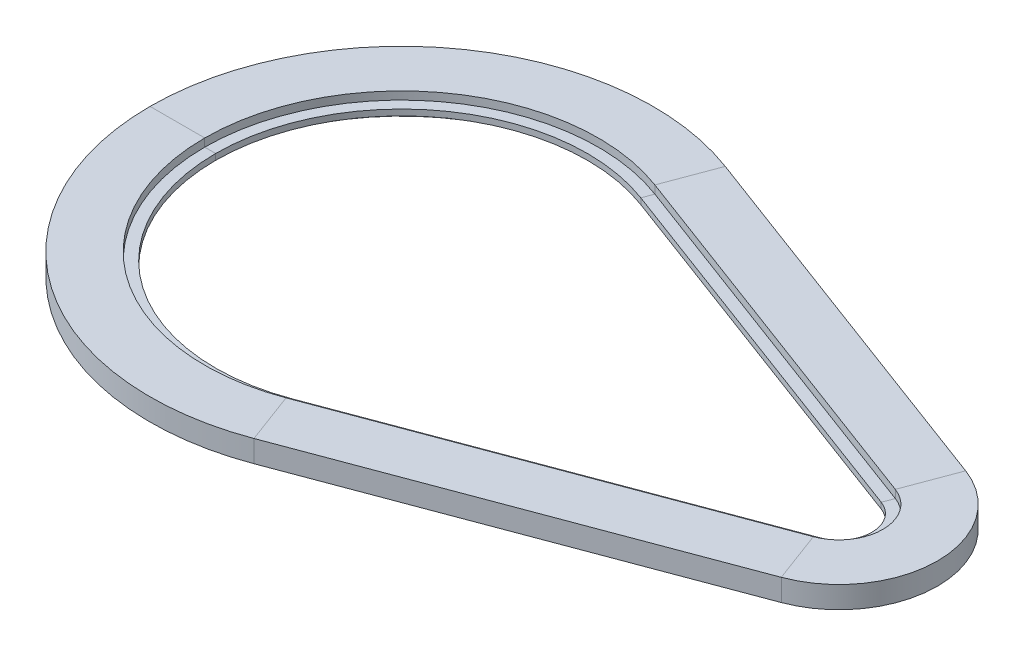
ISO-10303-21;
HEADER;
FILE_DESCRIPTION(('STEP AP214'),'2;1');
FILE_NAME('part.step','',(''),(''),'','','');
FILE_SCHEMA(('AUTOMOTIVE_DESIGN { 1 0 10303 214 1 1 1 1 }'));
ENDSEC;
DATA;
#1=APPLICATION_CONTEXT('core data for automotive mechanical design processes');
#2=APPLICATION_PROTOCOL_DEFINITION('international standard','automotive_design',2000,#1);
#3=PRODUCT_CONTEXT('',#1,'mechanical');
#4=PRODUCT('Part','Part','',(#3));
#5=PRODUCT_RELATED_PRODUCT_CATEGORY('part','',(#4));
#6=PRODUCT_DEFINITION_FORMATION('','',#4);
#7=PRODUCT_DEFINITION_CONTEXT('part definition',#1,'design');
#8=PRODUCT_DEFINITION('design','',#6,#7);
#9=PRODUCT_DEFINITION_SHAPE('','',#8);
#10=(LENGTH_UNIT() NAMED_UNIT(*) SI_UNIT(.MILLI.,.METRE.));
#11=(NAMED_UNIT(*) PLANE_ANGLE_UNIT() SI_UNIT($,.RADIAN.));
#12=(NAMED_UNIT(*) SI_UNIT($,.STERADIAN.) SOLID_ANGLE_UNIT());
#13=UNCERTAINTY_MEASURE_WITH_UNIT(LENGTH_MEASURE(1.E-05),#10,'distance_accuracy_value','');
#14=(GEOMETRIC_REPRESENTATION_CONTEXT(3) GLOBAL_UNCERTAINTY_ASSIGNED_CONTEXT((#13)) GLOBAL_UNIT_ASSIGNED_CONTEXT((#10,
#11,#12)) REPRESENTATION_CONTEXT('',''));
#15=CARTESIAN_POINT('',(0.,0.,0.));
#16=DIRECTION('',(0.,0.,1.));
#17=DIRECTION('',(1.,0.,0.));
#18=AXIS2_PLACEMENT_3D('',#15,#16,#17);
#19=CARTESIAN_POINT('',(0.,0.,0.));
#20=DIRECTION('',(0.,-1.,0.));
#21=DIRECTION('',(0.,0.,-1.));
#22=AXIS2_PLACEMENT_3D('',#19,#20,#21);
#23=CYLINDRICAL_SURFACE('',#22,57.15);
#24=DIRECTION('',(0.,1.,0.));
#25=VECTOR('',#24,1.);
#26=CARTESIAN_POINT('',(20.0025,0.863599999999993,53.5352453412702));
#27=LINE('',#26,#25);
#28=CARTESIAN_POINT('',(20.0025,0.863599999999993,53.5352453412703));
#29=VERTEX_POINT('',#28);
#30=CARTESIAN_POINT('',(20.0025,3.17499999999999,53.5352453412703));
#31=VERTEX_POINT('',#30);
#32=EDGE_CURVE('E228',#29,#31,#27,.T.);
#33=ORIENTED_EDGE('',*,*,#32,.F.);
#34=CARTESIAN_POINT('',(0.,0.863599999999993,0.));
#35=DIRECTION('',(0.,-1.,0.));
#36=DIRECTION('',(0.35,0.,0.93674969975976));
#37=AXIS2_PLACEMENT_3D('',#34,#35,#36);
#38=CIRCLE('',#37,57.15);
#39=CARTESIAN_POINT('',(-57.15,0.863599999999993,0.));
#40=VERTEX_POINT('',#39);
#41=EDGE_CURVE('E263',#29,#40,#38,.T.);
#42=ORIENTED_EDGE('',*,*,#41,.T.);
#43=DIRECTION('',(0.,1.,0.));
#44=VECTOR('',#43,1.);
#45=CARTESIAN_POINT('',(-57.15,0.863599999999993,0.));
#46=LINE('',#45,#44);
#47=CARTESIAN_POINT('',(-57.15,3.17499999999999,0.));
#48=VERTEX_POINT('',#47);
#49=EDGE_CURVE('E260',#40,#48,#46,.T.);
#50=ORIENTED_EDGE('',*,*,#49,.T.);
#51=CARTESIAN_POINT('',(0.,3.17499999999999,0.));
#52=DIRECTION('',(0.,-1.,0.));
#53=DIRECTION('',(0.35,0.,0.93674969975976));
#54=AXIS2_PLACEMENT_3D('',#51,#52,#53);
#55=CIRCLE('',#54,57.15);
#56=EDGE_CURVE('E254',#31,#48,#55,.T.);
#57=ORIENTED_EDGE('',*,*,#56,.F.);
#58=EDGE_LOOP('',(#33,#42,#50,#57));
#59=FACE_BOUND('',#58,.T.);
#60=ADVANCED_FACE('F39',(#59),#23,.F.);
#61=CARTESIAN_POINT('',(0.,0.,0.));
#62=DIRECTION('',(0.,-1.,0.));
#63=DIRECTION('',(0.,0.,-1.));
#64=AXIS2_PLACEMENT_3D('',#61,#62,#63);
#65=CYLINDRICAL_SURFACE('',#64,57.15);
#66=CARTESIAN_POINT('',(0.,3.17499999999999,0.));
#67=DIRECTION('',(0.,-1.,0.));
#68=DIRECTION('',(-1.,0.,0.));
#69=AXIS2_PLACEMENT_3D('',#66,#67,#68);
#70=CIRCLE('',#69,57.15);
#71=CARTESIAN_POINT('',(20.0024999999999,3.17499999999999,-53.5352453412703));
#72=VERTEX_POINT('',#71);
#73=EDGE_CURVE('E279',#48,#72,#70,.T.);
#74=ORIENTED_EDGE('',*,*,#73,.F.);
#75=ORIENTED_EDGE('',*,*,#49,.F.);
#76=CARTESIAN_POINT('',(0.,0.863599999999993,0.));
#77=DIRECTION('',(0.,-1.,0.));
#78=DIRECTION('',(-1.,0.,0.));
#79=AXIS2_PLACEMENT_3D('',#76,#77,#78);
#80=CIRCLE('',#79,57.15);
#81=CARTESIAN_POINT('',(20.0024999999999,0.863599999999993,-53.5352453412703));
#82=VERTEX_POINT('',#81);
#83=EDGE_CURVE('E452',#40,#82,#80,.T.);
#84=ORIENTED_EDGE('',*,*,#83,.T.);
#85=DIRECTION('',(0.,1.,0.));
#86=VECTOR('',#85,1.);
#87=CARTESIAN_POINT('',(20.0024999999999,0.863599999999993,-53.5352453412703));
#88=LINE('',#87,#86);
#89=EDGE_CURVE('E510',#82,#72,#88,.T.);
#90=ORIENTED_EDGE('',*,*,#89,.T.);
#91=EDGE_LOOP('',(#74,#75,#84,#90));
#92=FACE_BOUND('',#91,.T.);
#93=ADVANCED_FACE('F519',(#92),#65,.F.);
#94=CARTESIAN_POINT('',(-57.15,3.17499999999999,0.));
#95=DIRECTION('',(0.,-1.,0.));
#96=DIRECTION('',(0.,0.,-1.));
#97=AXIS2_PLACEMENT_3D('',#94,#95,#96);
#98=PLANE('',#97);
#99=CARTESIAN_POINT('',(0.,3.17499999999999,0.));
#100=DIRECTION('',(0.,-1.,0.));
#101=DIRECTION('',(-1.,0.,0.));
#102=AXIS2_PLACEMENT_3D('',#99,#100,#101);
#103=CIRCLE('',#102,73.025);
#104=CARTESIAN_POINT('',(-73.025,3.17499999999999,0.));
#105=VERTEX_POINT('',#104);
#106=CARTESIAN_POINT('',(25.5587499999999,3.17499999999999,-68.4061468249565));
#107=VERTEX_POINT('',#106);
#108=EDGE_CURVE('E205',#105,#107,#103,.T.);
#109=ORIENTED_EDGE('',*,*,#108,.F.);
#110=DIRECTION('',(-1.,0.,0.));
#111=VECTOR('',#110,1.);
#112=CARTESIAN_POINT('',(-57.15,3.17499999999999,0.));
#113=LINE('',#112,#111);
#114=EDGE_CURVE('E272',#48,#105,#113,.T.);
#115=ORIENTED_EDGE('',*,*,#114,.F.);
#116=ORIENTED_EDGE('',*,*,#73,.T.);
#117=DIRECTION('',(0.349999999999999,0.,-0.93674969975976));
#118=VECTOR('',#117,1.);
#119=CARTESIAN_POINT('',(20.0024999999999,3.17499999999999,-53.5352453412703));
#120=LINE('',#119,#118);
#121=EDGE_CURVE('E276',#72,#107,#120,.T.);
#122=ORIENTED_EDGE('',*,*,#121,.T.);
#123=EDGE_LOOP('',(#109,#115,#116,#122));
#124=FACE_BOUND('',#123,.T.);
#125=ADVANCED_FACE('F548',(#124),#98,.F.);
#126=CARTESIAN_POINT('',(0.,0.,0.));
#127=DIRECTION('',(0.,-1.,0.));
#128=DIRECTION('',(0.,0.,-1.));
#129=AXIS2_PLACEMENT_3D('',#126,#127,#128);
#130=CYLINDRICAL_SURFACE('',#129,73.025);
#131=CARTESIAN_POINT('',(0.,-3.17500000000001,0.));
#132=DIRECTION('',(0.,-1.,0.));
#133=DIRECTION('',(-1.,0.,0.));
#134=AXIS2_PLACEMENT_3D('',#131,#132,#133);
#135=CIRCLE('',#134,73.025);
#136=CARTESIAN_POINT('',(-73.025,-3.17500000000001,0.));
#137=VERTEX_POINT('',#136);
#138=CARTESIAN_POINT('',(25.5587499999999,-3.17500000000001,-68.4061468249565));
#139=VERTEX_POINT('',#138);
#140=EDGE_CURVE('E180',#137,#139,#135,.T.);
#141=ORIENTED_EDGE('',*,*,#140,.F.);
#142=DIRECTION('',(0.,-1.,0.));
#143=VECTOR('',#142,1.);
#144=CARTESIAN_POINT('',(-73.025,3.17499999999999,0.));
#145=LINE('',#144,#143);
#146=EDGE_CURVE('E275',#105,#137,#145,.T.);
#147=ORIENTED_EDGE('',*,*,#146,.F.);
#148=ORIENTED_EDGE('',*,*,#108,.T.);
#149=DIRECTION('',(0.,-1.,0.));
#150=VECTOR('',#149,1.);
#151=CARTESIAN_POINT('',(25.5587499999999,3.17499999999999,-68.4061468249565));
#152=LINE('',#151,#150);
#153=EDGE_CURVE('E282',#107,#139,#152,.T.);
#154=ORIENTED_EDGE('',*,*,#153,.T.);
#155=EDGE_LOOP('',(#141,#147,#148,#154));
#156=FACE_BOUND('',#155,.T.);
#157=ADVANCED_FACE('F554',(#156),#130,.T.);
#158=CARTESIAN_POINT('',(-73.025,-3.17500000000001,0.));
#159=DIRECTION('',(0.,1.,0.));
#160=DIRECTION('',(0.,0.,1.));
#161=AXIS2_PLACEMENT_3D('',#158,#159,#160);
#162=PLANE('',#161);
#163=CARTESIAN_POINT('',(0.,-3.17500000000001,0.));
#164=DIRECTION('',(0.,-1.,0.));
#165=DIRECTION('',(-1.,0.,0.));
#166=AXIS2_PLACEMENT_3D('',#163,#164,#165);
#167=CIRCLE('',#166,57.15);
#168=CARTESIAN_POINT('',(-57.15,-3.17500000000001,0.));
#169=VERTEX_POINT('',#168);
#170=CARTESIAN_POINT('',(20.0024999999999,-3.17500000000001,-53.5352453412703));
#171=VERTEX_POINT('',#170);
#172=EDGE_CURVE('E172',#169,#171,#167,.T.);
#173=ORIENTED_EDGE('',*,*,#172,.F.);
#174=DIRECTION('',(1.,0.,0.));
#175=VECTOR('',#174,1.);
#176=CARTESIAN_POINT('',(-73.025,-3.17500000000001,0.));
#177=LINE('',#176,#175);
#178=EDGE_CURVE('E306',#137,#169,#177,.T.);
#179=ORIENTED_EDGE('',*,*,#178,.F.);
#180=ORIENTED_EDGE('',*,*,#140,.T.);
#181=DIRECTION('',(-0.349999999999999,0.,0.93674969975976));
#182=VECTOR('',#181,1.);
#183=CARTESIAN_POINT('',(25.5587499999999,-3.17500000000001,-68.4061468249565));
#184=LINE('',#183,#182);
#185=EDGE_CURVE('E311',#139,#171,#184,.T.);
#186=ORIENTED_EDGE('',*,*,#185,.T.);
#187=EDGE_LOOP('',(#173,#179,#180,#186));
#188=FACE_BOUND('',#187,.T.);
#189=ADVANCED_FACE('F571',(#188),#162,.F.);
#190=CARTESIAN_POINT('',(0.,0.,0.));
#191=DIRECTION('',(0.,-1.,0.));
#192=DIRECTION('',(0.,0.,-1.));
#193=AXIS2_PLACEMENT_3D('',#190,#191,#192);
#194=CYLINDRICAL_SURFACE('',#193,57.15);
#195=CARTESIAN_POINT('',(0.,-0.863600000000007,0.));
#196=DIRECTION('',(0.,-1.,0.));
#197=DIRECTION('',(-1.,0.,0.));
#198=AXIS2_PLACEMENT_3D('',#195,#196,#197);
#199=CIRCLE('',#198,57.15);
#200=CARTESIAN_POINT('',(-57.15,-0.863600000000007,0.));
#201=VERTEX_POINT('',#200);
#202=CARTESIAN_POINT('',(20.0024999999999,-0.863600000000007,-53.5352453412703));
#203=VERTEX_POINT('',#202);
#204=EDGE_CURVE('E165',#201,#203,#199,.T.);
#205=ORIENTED_EDGE('',*,*,#204,.F.);
#206=DIRECTION('',(0.,1.,0.));
#207=VECTOR('',#206,1.);
#208=CARTESIAN_POINT('',(-57.15,-3.17500000000001,0.));
#209=LINE('',#208,#207);
#210=EDGE_CURVE('E338',#169,#201,#209,.T.);
#211=ORIENTED_EDGE('',*,*,#210,.F.);
#212=ORIENTED_EDGE('',*,*,#172,.T.);
#213=DIRECTION('',(0.,1.,0.));
#214=VECTOR('',#213,1.);
#215=CARTESIAN_POINT('',(20.0024999999999,-3.17500000000001,-53.5352453412703));
#216=LINE('',#215,#214);
#217=EDGE_CURVE('E343',#171,#203,#216,.T.);
#218=ORIENTED_EDGE('',*,*,#217,.T.);
#219=EDGE_LOOP('',(#205,#211,#212,#218));
#220=FACE_BOUND('',#219,.T.);
#221=ADVANCED_FACE('F589',(#220),#194,.F.);
#222=CARTESIAN_POINT('',(-57.15,-0.863600000000007,0.));
#223=DIRECTION('',(0.,1.,0.));
#224=DIRECTION('',(0.,0.,1.));
#225=AXIS2_PLACEMENT_3D('',#222,#223,#224);
#226=PLANE('',#225);
#227=CARTESIAN_POINT('',(0.,-0.863600000000007,0.));
#228=DIRECTION('',(0.,-1.,0.));
#229=DIRECTION('',(-1.,0.,0.));
#230=AXIS2_PLACEMENT_3D('',#227,#228,#229);
#231=CIRCLE('',#230,53.975);
#232=CARTESIAN_POINT('',(-53.975,-0.863600000000007,0.));
#233=VERTEX_POINT('',#232);
#234=CARTESIAN_POINT('',(18.8912499999999,-0.863600000000007,-50.561065044533));
#235=VERTEX_POINT('',#234);
#236=EDGE_CURVE('E401',#233,#235,#231,.T.);
#237=ORIENTED_EDGE('',*,*,#236,.F.);
#238=DIRECTION('',(1.,0.,0.));
#239=VECTOR('',#238,1.);
#240=CARTESIAN_POINT('',(-57.15,-0.863600000000007,0.));
#241=LINE('',#240,#239);
#242=EDGE_CURVE('E369',#201,#233,#241,.T.);
#243=ORIENTED_EDGE('',*,*,#242,.F.);
#244=ORIENTED_EDGE('',*,*,#204,.T.);
#245=DIRECTION('',(-0.349999999999999,0.,0.93674969975976));
#246=VECTOR('',#245,1.);
#247=CARTESIAN_POINT('',(20.0024999999999,-0.863600000000007,-53.5352453412703));
#248=LINE('',#247,#246);
#249=EDGE_CURVE('E374',#203,#235,#248,.T.);
#250=ORIENTED_EDGE('',*,*,#249,.T.);
#251=EDGE_LOOP('',(#237,#243,#244,#250));
#252=FACE_BOUND('',#251,.T.);
#253=ADVANCED_FACE('F608',(#252),#226,.F.);
#254=CARTESIAN_POINT('',(0.,0.,0.));
#255=DIRECTION('',(0.,-1.,0.));
#256=DIRECTION('',(0.,0.,-1.));
#257=AXIS2_PLACEMENT_3D('',#254,#255,#256);
#258=CYLINDRICAL_SURFACE('',#257,53.975);
#259=CARTESIAN_POINT('',(0.,0.863599999999993,0.));
#260=DIRECTION('',(0.,-1.,0.));
#261=DIRECTION('',(-1.,0.,0.));
#262=AXIS2_PLACEMENT_3D('',#259,#260,#261);
#263=CIRCLE('',#262,53.975);
#264=CARTESIAN_POINT('',(-53.975,0.863599999999993,0.));
#265=VERTEX_POINT('',#264);
#266=CARTESIAN_POINT('',(18.8912499999999,0.863599999999993,-50.561065044533));
#267=VERTEX_POINT('',#266);
#268=EDGE_CURVE('E430',#265,#267,#263,.T.);
#269=ORIENTED_EDGE('',*,*,#268,.F.);
#270=DIRECTION('',(0.,1.,0.));
#271=VECTOR('',#270,1.);
#272=CARTESIAN_POINT('',(-53.975,-0.863600000000007,0.));
#273=LINE('',#272,#271);
#274=EDGE_CURVE('E398',#233,#265,#273,.T.);
#275=ORIENTED_EDGE('',*,*,#274,.F.);
#276=ORIENTED_EDGE('',*,*,#236,.T.);
#277=DIRECTION('',(0.,1.,0.));
#278=VECTOR('',#277,1.);
#279=CARTESIAN_POINT('',(18.8912499999999,-0.863600000000007,-50.561065044533));
#280=LINE('',#279,#278);
#281=EDGE_CURVE('E404',#235,#267,#280,.T.);
#282=ORIENTED_EDGE('',*,*,#281,.T.);
#283=EDGE_LOOP('',(#269,#275,#276,#282));
#284=FACE_BOUND('',#283,.T.);
#285=ADVANCED_FACE('F625',(#284),#258,.F.);
#286=CARTESIAN_POINT('',(-53.975,0.863599999999993,0.));
#287=DIRECTION('',(0.,-1.,0.));
#288=DIRECTION('',(0.,0.,-1.));
#289=AXIS2_PLACEMENT_3D('',#286,#287,#288);
#290=PLANE('',#289);
#291=DIRECTION('',(0.349999999999999,0.,-0.93674969975976));
#292=VECTOR('',#291,1.);
#293=CARTESIAN_POINT('',(18.8912499999999,0.863599999999993,-50.561065044533));
#294=LINE('',#293,#292);
#295=EDGE_CURVE('E433',#267,#82,#294,.T.);
#296=ORIENTED_EDGE('',*,*,#295,.T.);
#297=ORIENTED_EDGE('',*,*,#83,.F.);
#298=DIRECTION('',(-1.,0.,0.));
#299=VECTOR('',#298,1.);
#300=CARTESIAN_POINT('',(-53.975,0.863599999999993,0.));
#301=LINE('',#300,#299);
#302=EDGE_CURVE('E426',#265,#40,#301,.T.);
#303=ORIENTED_EDGE('',*,*,#302,.F.);
#304=ORIENTED_EDGE('',*,*,#268,.T.);
#305=EDGE_LOOP('',(#296,#297,#303,#304));
#306=FACE_BOUND('',#305,.T.);
#307=ADVANCED_FACE('F527',(#306),#290,.F.);
#308=CARTESIAN_POINT('',(20.0025,0.863599999999993,-53.5352453412703));
#309=DIRECTION('',(0.35,0.,-0.93674969975976));
#310=DIRECTION('',(-0.93674969975976,0.,-0.35));
#311=AXIS2_PLACEMENT_3D('',#308,#309,#310);
#312=PLANE('',#311);
#313=DIRECTION('',(0.93674969975976,0.,0.35));
#314=VECTOR('',#313,1.);
#315=CARTESIAN_POINT('',(20.0025,3.17499999999999,-53.5352453412703));
#316=LINE('',#315,#314);
#317=CARTESIAN_POINT('',(131.445,3.17499999999999,-11.8967211869489));
#318=VERTEX_POINT('',#317);
#319=EDGE_CURVE('E288',#72,#318,#316,.T.);
#320=ORIENTED_EDGE('',*,*,#319,.F.);
#321=ORIENTED_EDGE('',*,*,#89,.F.);
#322=DIRECTION('',(0.93674969975976,0.,0.35));
#323=VECTOR('',#322,1.);
#324=CARTESIAN_POINT('',(20.0025,0.863599999999993,-53.5352453412703));
#325=LINE('',#324,#323);
#326=CARTESIAN_POINT('',(131.445,0.863599999999993,-11.8967211869489));
#327=VERTEX_POINT('',#326);
#328=EDGE_CURVE('E456',#82,#327,#325,.T.);
#329=ORIENTED_EDGE('',*,*,#328,.T.);
#330=DIRECTION('',(0.,1.,0.));
#331=VECTOR('',#330,1.);
#332=CARTESIAN_POINT('',(131.445,0.863599999999993,-11.8967211869489));
#333=LINE('',#332,#331);
#334=EDGE_CURVE('E504',#327,#318,#333,.T.);
#335=ORIENTED_EDGE('',*,*,#334,.T.);
#336=EDGE_LOOP('',(#320,#321,#329,#335));
#337=FACE_BOUND('',#336,.T.);
#338=ADVANCED_FACE('F523',(#337),#312,.F.);
#339=CARTESIAN_POINT('',(20.0025,3.17499999999999,-53.5352453412703));
#340=DIRECTION('',(0.,-1.,0.));
#341=DIRECTION('',(0.,0.,-1.));
#342=AXIS2_PLACEMENT_3D('',#339,#340,#341);
#343=PLANE('',#342);
#344=DIRECTION('',(0.93674969975976,0.,0.35));
#345=VECTOR('',#344,1.);
#346=CARTESIAN_POINT('',(25.55875,3.17499999999999,-68.4061468249565));
#347=LINE('',#346,#345);
#348=CARTESIAN_POINT('',(137.00125,3.17499999999999,-26.7676226706351));
#349=VERTEX_POINT('',#348);
#350=EDGE_CURVE('E287',#107,#349,#347,.T.);
#351=ORIENTED_EDGE('',*,*,#350,.F.);
#352=ORIENTED_EDGE('',*,*,#121,.F.);
#353=ORIENTED_EDGE('',*,*,#319,.T.);
#354=DIRECTION('',(0.35,0.,-0.93674969975976));
#355=VECTOR('',#354,1.);
#356=CARTESIAN_POINT('',(131.445,3.17499999999999,-11.8967211869489));
#357=LINE('',#356,#355);
#358=EDGE_CURVE('E283',#318,#349,#357,.T.);
#359=ORIENTED_EDGE('',*,*,#358,.T.);
#360=EDGE_LOOP('',(#351,#352,#353,#359));
#361=FACE_BOUND('',#360,.T.);
#362=ADVANCED_FACE('F555',(#361),#343,.F.);
#363=CARTESIAN_POINT('',(25.55875,3.17499999999999,-68.4061468249565));
#364=DIRECTION('',(-0.35,0.,0.93674969975976));
#365=DIRECTION('',(0.93674969975976,0.,0.35));
#366=AXIS2_PLACEMENT_3D('',#363,#364,#365);
#367=PLANE('',#366);
#368=DIRECTION('',(0.93674969975976,0.,0.35));
#369=VECTOR('',#368,1.);
#370=CARTESIAN_POINT('',(25.55875,-3.17500000000001,-68.4061468249565));
#371=LINE('',#370,#369);
#372=CARTESIAN_POINT('',(137.00125,-3.17500000000001,-26.7676226706351));
#373=VERTEX_POINT('',#372);
#374=EDGE_CURVE('E315',#139,#373,#371,.T.);
#375=ORIENTED_EDGE('',*,*,#374,.F.);
#376=ORIENTED_EDGE('',*,*,#153,.F.);
#377=ORIENTED_EDGE('',*,*,#350,.T.);
#378=DIRECTION('',(0.,-1.,0.));
#379=VECTOR('',#378,1.);
#380=CARTESIAN_POINT('',(137.00125,3.17499999999999,-26.7676226706351));
#381=LINE('',#380,#379);
#382=EDGE_CURVE('E291',#349,#373,#381,.T.);
#383=ORIENTED_EDGE('',*,*,#382,.T.);
#384=EDGE_LOOP('',(#375,#376,#377,#383));
#385=FACE_BOUND('',#384,.T.);
#386=ADVANCED_FACE('F558',(#385),#367,.F.);
#387=CARTESIAN_POINT('',(25.55875,-3.17500000000001,-68.4061468249565));
#388=DIRECTION('',(0.,1.,0.));
#389=DIRECTION('',(0.,0.,1.));
#390=AXIS2_PLACEMENT_3D('',#387,#388,#389);
#391=PLANE('',#390);
#392=DIRECTION('',(0.93674969975976,0.,0.35));
#393=VECTOR('',#392,1.);
#394=CARTESIAN_POINT('',(20.0025,-3.17500000000001,-53.5352453412703));
#395=LINE('',#394,#393);
#396=CARTESIAN_POINT('',(131.445,-3.17500000000001,-11.8967211869489));
#397=VERTEX_POINT('',#396);
#398=EDGE_CURVE('E147',#171,#397,#395,.T.);
#399=ORIENTED_EDGE('',*,*,#398,.F.);
#400=ORIENTED_EDGE('',*,*,#185,.F.);
#401=ORIENTED_EDGE('',*,*,#374,.T.);
#402=DIRECTION('',(-0.35,0.,0.93674969975976));
#403=VECTOR('',#402,1.);
#404=CARTESIAN_POINT('',(137.00125,-3.17500000000001,-26.7676226706351));
#405=LINE('',#404,#403);
#406=EDGE_CURVE('E318',#373,#397,#405,.T.);
#407=ORIENTED_EDGE('',*,*,#406,.T.);
#408=EDGE_LOOP('',(#399,#400,#401,#407));
#409=FACE_BOUND('',#408,.T.);
#410=ADVANCED_FACE('F574',(#409),#391,.F.);
#411=CARTESIAN_POINT('',(20.0025,-3.17500000000001,-53.5352453412703));
#412=DIRECTION('',(0.35,0.,-0.93674969975976));
#413=DIRECTION('',(-0.93674969975976,0.,-0.35));
#414=AXIS2_PLACEMENT_3D('',#411,#412,#413);
#415=PLANE('',#414);
#416=DIRECTION('',(0.93674969975976,0.,0.35));
#417=VECTOR('',#416,1.);
#418=CARTESIAN_POINT('',(20.0025,-0.863600000000007,-53.5352453412703));
#419=LINE('',#418,#417);
#420=CARTESIAN_POINT('',(131.445,-0.863600000000007,-11.8967211869489));
#421=VERTEX_POINT('',#420);
#422=EDGE_CURVE('E139',#203,#421,#419,.T.);
#423=ORIENTED_EDGE('',*,*,#422,.F.);
#424=ORIENTED_EDGE('',*,*,#217,.F.);
#425=ORIENTED_EDGE('',*,*,#398,.T.);
#426=DIRECTION('',(0.,1.,0.));
#427=VECTOR('',#426,1.);
#428=CARTESIAN_POINT('',(131.445,-3.17500000000001,-11.8967211869489));
#429=LINE('',#428,#427);
#430=EDGE_CURVE('E348',#397,#421,#429,.T.);
#431=ORIENTED_EDGE('',*,*,#430,.T.);
#432=EDGE_LOOP('',(#423,#424,#425,#431));
#433=FACE_BOUND('',#432,.T.);
#434=ADVANCED_FACE('F592',(#433),#415,.F.);
#435=CARTESIAN_POINT('',(20.0025,-0.863600000000007,-53.5352453412703));
#436=DIRECTION('',(0.,1.,0.));
#437=DIRECTION('',(0.,0.,1.));
#438=AXIS2_PLACEMENT_3D('',#435,#436,#437);
#439=PLANE('',#438);
#440=DIRECTION('',(0.93674969975976,0.,0.35));
#441=VECTOR('',#440,1.);
#442=CARTESIAN_POINT('',(18.89125,-0.863600000000007,-50.561065044533));
#443=LINE('',#442,#441);
#444=CARTESIAN_POINT('',(130.33375,-0.863600000000007,-8.9225408902117));
#445=VERTEX_POINT('',#444);
#446=EDGE_CURVE('E132',#235,#445,#443,.T.);
#447=ORIENTED_EDGE('',*,*,#446,.F.);
#448=ORIENTED_EDGE('',*,*,#249,.F.);
#449=ORIENTED_EDGE('',*,*,#422,.T.);
#450=DIRECTION('',(-0.35,0.,0.93674969975976));
#451=VECTOR('',#450,1.);
#452=CARTESIAN_POINT('',(131.445,-0.863600000000007,-11.8967211869489));
#453=LINE('',#452,#451);
#454=EDGE_CURVE('E379',#421,#445,#453,.T.);
#455=ORIENTED_EDGE('',*,*,#454,.T.);
#456=EDGE_LOOP('',(#447,#448,#449,#455));
#457=FACE_BOUND('',#456,.T.);
#458=ADVANCED_FACE('F611',(#457),#439,.F.);
#459=CARTESIAN_POINT('',(18.89125,-0.863600000000007,-50.561065044533));
#460=DIRECTION('',(0.35,0.,-0.93674969975976));
#461=DIRECTION('',(-0.93674969975976,0.,-0.35));
#462=AXIS2_PLACEMENT_3D('',#459,#460,#461);
#463=PLANE('',#462);
#464=DIRECTION('',(0.93674969975976,0.,0.35));
#465=VECTOR('',#464,1.);
#466=CARTESIAN_POINT('',(18.89125,0.863599999999993,-50.561065044533));
#467=LINE('',#466,#465);
#468=CARTESIAN_POINT('',(130.33375,0.863599999999993,-8.9225408902117));
#469=VERTEX_POINT('',#468);
#470=EDGE_CURVE('E436',#267,#469,#467,.T.);
#471=ORIENTED_EDGE('',*,*,#470,.F.);
#472=ORIENTED_EDGE('',*,*,#281,.F.);
#473=ORIENTED_EDGE('',*,*,#446,.T.);
#474=DIRECTION('',(0.,1.,0.));
#475=VECTOR('',#474,1.);
#476=CARTESIAN_POINT('',(130.33375,-0.863600000000007,-8.9225408902117));
#477=LINE('',#476,#475);
#478=EDGE_CURVE('E409',#445,#469,#477,.T.);
#479=ORIENTED_EDGE('',*,*,#478,.T.);
#480=EDGE_LOOP('',(#471,#472,#473,#479));
#481=FACE_BOUND('',#480,.T.);
#482=ADVANCED_FACE('F628',(#481),#463,.F.);
#483=CARTESIAN_POINT('',(18.89125,0.863599999999993,-50.561065044533));
#484=DIRECTION('',(0.,-1.,0.));
#485=DIRECTION('',(0.,0.,-1.));
#486=AXIS2_PLACEMENT_3D('',#483,#484,#485);
#487=PLANE('',#486);
#488=DIRECTION('',(0.35,0.,-0.93674969975976));
#489=VECTOR('',#488,1.);
#490=CARTESIAN_POINT('',(130.33375,0.863599999999993,-8.9225408902117));
#491=LINE('',#490,#489);
#492=EDGE_CURVE('E439',#469,#327,#491,.T.);
#493=ORIENTED_EDGE('',*,*,#492,.T.);
#494=ORIENTED_EDGE('',*,*,#328,.F.);
#495=ORIENTED_EDGE('',*,*,#295,.F.);
#496=ORIENTED_EDGE('',*,*,#470,.T.);
#497=EDGE_LOOP('',(#493,#494,#495,#496));
#498=FACE_BOUND('',#497,.T.);
#499=ADVANCED_FACE('F529',(#498),#487,.F.);
#500=CARTESIAN_POINT('',(127.,0.,0.));
#501=DIRECTION('',(0.,-1.,0.));
#502=DIRECTION('',(0.,0.,-1.));
#503=AXIS2_PLACEMENT_3D('',#500,#501,#502);
#504=CYLINDRICAL_SURFACE('',#503,12.7);
#505=CARTESIAN_POINT('',(127.,3.17499999999999,0.));
#506=DIRECTION('',(0.,-1.,0.));
#507=DIRECTION('',(0.349999999999998,0.,-0.93674969975976));
#508=AXIS2_PLACEMENT_3D('',#505,#506,#507);
#509=CIRCLE('',#508,12.7);
#510=CARTESIAN_POINT('',(131.445,3.17499999999999,11.8967211869489));
#511=VERTEX_POINT('',#510);
#512=EDGE_CURVE('E299',#318,#511,#509,.T.);
#513=ORIENTED_EDGE('',*,*,#512,.F.);
#514=ORIENTED_EDGE('',*,*,#334,.F.);
#515=CARTESIAN_POINT('',(127.,0.863599999999993,0.));
#516=DIRECTION('',(0.,-1.,0.));
#517=DIRECTION('',(0.349999999999998,0.,-0.93674969975976));
#518=AXIS2_PLACEMENT_3D('',#515,#516,#517);
#519=CIRCLE('',#518,12.7);
#520=CARTESIAN_POINT('',(131.445,0.863599999999993,11.8967211869489));
#521=VERTEX_POINT('',#520);
#522=EDGE_CURVE('E459',#327,#521,#519,.T.);
#523=ORIENTED_EDGE('',*,*,#522,.T.);
#524=DIRECTION('',(0.,1.,0.));
#525=VECTOR('',#524,1.);
#526=CARTESIAN_POINT('',(131.445,0.863599999999993,11.8967211869489));
#527=LINE('',#526,#525);
#528=EDGE_CURVE('E295',#521,#511,#527,.T.);
#529=ORIENTED_EDGE('',*,*,#528,.T.);
#530=EDGE_LOOP('',(#513,#514,#523,#529));
#531=FACE_BOUND('',#530,.T.);
#532=ADVANCED_FACE('F495',(#531),#504,.F.);
#533=CARTESIAN_POINT('',(131.445,3.17499999999999,-11.896721186949));
#534=DIRECTION('',(0.,-1.,0.));
#535=DIRECTION('',(0.,0.,-1.));
#536=AXIS2_PLACEMENT_3D('',#533,#534,#535);
#537=PLANE('',#536);
#538=CARTESIAN_POINT('',(127.,3.17499999999999,0.));
#539=DIRECTION('',(0.,-1.,0.));
#540=DIRECTION('',(0.35,0.,-0.93674969975976));
#541=AXIS2_PLACEMENT_3D('',#538,#539,#540);
#542=CIRCLE('',#541,28.575);
#543=CARTESIAN_POINT('',(137.00125,3.17499999999999,26.7676226706351));
#544=VERTEX_POINT('',#543);
#545=EDGE_CURVE('E296',#349,#544,#542,.T.);
#546=ORIENTED_EDGE('',*,*,#545,.F.);
#547=ORIENTED_EDGE('',*,*,#358,.F.);
#548=ORIENTED_EDGE('',*,*,#512,.T.);
#549=DIRECTION('',(0.350000000000005,0.,0.936749699759758));
#550=VECTOR('',#549,1.);
#551=CARTESIAN_POINT('',(131.445,3.17499999999999,11.8967211869489));
#552=LINE('',#551,#550);
#553=EDGE_CURVE('E247',#511,#544,#552,.T.);
#554=ORIENTED_EDGE('',*,*,#553,.T.);
#555=EDGE_LOOP('',(#546,#547,#548,#554));
#556=FACE_BOUND('',#555,.T.);
#557=ADVANCED_FACE('F490',(#556),#537,.F.);
#558=CARTESIAN_POINT('',(127.,0.,0.));
#559=DIRECTION('',(0.,-1.,0.));
#560=DIRECTION('',(0.,0.,-1.));
#561=AXIS2_PLACEMENT_3D('',#558,#559,#560);
#562=CYLINDRICAL_SURFACE('',#561,28.575);
#563=CARTESIAN_POINT('',(127.,-3.17500000000001,0.));
#564=DIRECTION('',(0.,-1.,0.));
#565=DIRECTION('',(0.35,0.,-0.93674969975976));
#566=AXIS2_PLACEMENT_3D('',#563,#564,#565);
#567=CIRCLE('',#566,28.575);
#568=CARTESIAN_POINT('',(137.00125,-3.17500000000001,26.7676226706351));
#569=VERTEX_POINT('',#568);
#570=EDGE_CURVE('E298',#373,#569,#567,.T.);
#571=ORIENTED_EDGE('',*,*,#570,.F.);
#572=ORIENTED_EDGE('',*,*,#382,.F.);
#573=ORIENTED_EDGE('',*,*,#545,.T.);
#574=DIRECTION('',(0.,-1.,0.));
#575=VECTOR('',#574,1.);
#576=CARTESIAN_POINT('',(137.00125,3.17499999999999,26.7676226706351));
#577=LINE('',#576,#575);
#578=EDGE_CURVE('E294',#544,#569,#577,.T.);
#579=ORIENTED_EDGE('',*,*,#578,.T.);
#580=EDGE_LOOP('',(#571,#572,#573,#579));
#581=FACE_BOUND('',#580,.T.);
#582=ADVANCED_FACE('F562',(#581),#562,.T.);
#583=CARTESIAN_POINT('',(137.00125,-3.17500000000001,-26.7676226706351));
#584=DIRECTION('',(0.,1.,0.));
#585=DIRECTION('',(0.,0.,1.));
#586=AXIS2_PLACEMENT_3D('',#583,#584,#585);
#587=PLANE('',#586);
#588=CARTESIAN_POINT('',(127.,-3.17500000000001,0.));
#589=DIRECTION('',(0.,-1.,0.));
#590=DIRECTION('',(0.349999999999998,0.,-0.93674969975976));
#591=AXIS2_PLACEMENT_3D('',#588,#589,#590);
#592=CIRCLE('',#591,12.7);
#593=CARTESIAN_POINT('',(131.445,-3.17500000000001,11.8967211869489));
#594=VERTEX_POINT('',#593);
#595=EDGE_CURVE('E325',#397,#594,#592,.T.);
#596=ORIENTED_EDGE('',*,*,#595,.F.);
#597=ORIENTED_EDGE('',*,*,#406,.F.);
#598=ORIENTED_EDGE('',*,*,#570,.T.);
#599=DIRECTION('',(-0.350000000000005,0.,-0.936749699759758));
#600=VECTOR('',#599,1.);
#601=CARTESIAN_POINT('',(137.00125,-3.17500000000001,26.7676226706351));
#602=LINE('',#601,#600);
#603=EDGE_CURVE('E322',#569,#594,#602,.T.);
#604=ORIENTED_EDGE('',*,*,#603,.T.);
#605=EDGE_LOOP('',(#596,#597,#598,#604));
#606=FACE_BOUND('',#605,.T.);
#607=ADVANCED_FACE('F578',(#606),#587,.F.);
#608=CARTESIAN_POINT('',(127.,0.,0.));
#609=DIRECTION('',(0.,-1.,0.));
#610=DIRECTION('',(0.,0.,-1.));
#611=AXIS2_PLACEMENT_3D('',#608,#609,#610);
#612=CYLINDRICAL_SURFACE('',#611,12.7);
#613=CARTESIAN_POINT('',(127.,-0.863600000000007,0.));
#614=DIRECTION('',(0.,-1.,0.));
#615=DIRECTION('',(0.349999999999998,0.,-0.93674969975976));
#616=AXIS2_PLACEMENT_3D('',#613,#614,#615);
#617=CIRCLE('',#616,12.7);
#618=CARTESIAN_POINT('',(131.445,-0.863600000000007,11.8967211869489));
#619=VERTEX_POINT('',#618);
#620=EDGE_CURVE('E113',#421,#619,#617,.T.);
#621=ORIENTED_EDGE('',*,*,#620,.F.);
#622=ORIENTED_EDGE('',*,*,#430,.F.);
#623=ORIENTED_EDGE('',*,*,#595,.T.);
#624=DIRECTION('',(0.,1.,0.));
#625=VECTOR('',#624,1.);
#626=CARTESIAN_POINT('',(131.445,-3.17500000000001,11.8967211869489));
#627=LINE('',#626,#625);
#628=EDGE_CURVE('E352',#594,#619,#627,.T.);
#629=ORIENTED_EDGE('',*,*,#628,.T.);
#630=EDGE_LOOP('',(#621,#622,#623,#629));
#631=FACE_BOUND('',#630,.T.);
#632=ADVANCED_FACE('F596',(#631),#612,.F.);
#633=CARTESIAN_POINT('',(131.445,-0.863600000000007,-11.896721186949));
#634=DIRECTION('',(0.,1.,0.));
#635=DIRECTION('',(0.,0.,1.));
#636=AXIS2_PLACEMENT_3D('',#633,#634,#635);
#637=PLANE('',#636);
#638=CARTESIAN_POINT('',(127.,-0.863600000000007,0.));
#639=DIRECTION('',(0.,-1.,0.));
#640=DIRECTION('',(0.349999999999999,0.,-0.93674969975976));
#641=AXIS2_PLACEMENT_3D('',#638,#639,#640);
#642=CIRCLE('',#641,9.52500000000001);
#643=CARTESIAN_POINT('',(130.33375,-0.863600000000007,8.9225408902117));
#644=VERTEX_POINT('',#643);
#645=EDGE_CURVE('E105',#445,#644,#642,.T.);
#646=ORIENTED_EDGE('',*,*,#645,.F.);
#647=ORIENTED_EDGE('',*,*,#454,.F.);
#648=ORIENTED_EDGE('',*,*,#620,.T.);
#649=DIRECTION('',(-0.350000000000005,0.,-0.936749699759758));
#650=VECTOR('',#649,1.);
#651=CARTESIAN_POINT('',(131.445,-0.863600000000007,11.8967211869489));
#652=LINE('',#651,#650);
#653=EDGE_CURVE('E382',#619,#644,#652,.T.);
#654=ORIENTED_EDGE('',*,*,#653,.T.);
#655=EDGE_LOOP('',(#646,#647,#648,#654));
#656=FACE_BOUND('',#655,.T.);
#657=ADVANCED_FACE('F540',(#656),#637,.F.);
#658=CARTESIAN_POINT('',(127.,0.,0.));
#659=DIRECTION('',(0.,-1.,0.));
#660=DIRECTION('',(0.,0.,-1.));
#661=AXIS2_PLACEMENT_3D('',#658,#659,#660);
#662=CYLINDRICAL_SURFACE('',#661,9.52500000000001);
#663=CARTESIAN_POINT('',(127.,0.863599999999993,0.));
#664=DIRECTION('',(0.,-1.,0.));
#665=DIRECTION('',(0.349999999999999,0.,-0.93674969975976));
#666=AXIS2_PLACEMENT_3D('',#663,#664,#665);
#667=CIRCLE('',#666,9.52500000000001);
#668=CARTESIAN_POINT('',(130.33375,0.863599999999993,8.9225408902117));
#669=VERTEX_POINT('',#668);
#670=EDGE_CURVE('E95',#469,#669,#667,.T.);
#671=ORIENTED_EDGE('',*,*,#670,.F.);
#672=ORIENTED_EDGE('',*,*,#478,.F.);
#673=ORIENTED_EDGE('',*,*,#645,.T.);
#674=DIRECTION('',(0.,1.,0.));
#675=VECTOR('',#674,1.);
#676=CARTESIAN_POINT('',(130.33375,-0.863600000000007,8.92254089021169));
#677=LINE('',#676,#675);
#678=EDGE_CURVE('E412',#644,#669,#677,.T.);
#679=ORIENTED_EDGE('',*,*,#678,.T.);
#680=EDGE_LOOP('',(#671,#672,#673,#679));
#681=FACE_BOUND('',#680,.T.);
#682=ADVANCED_FACE('F533',(#681),#662,.F.);
#683=CARTESIAN_POINT('',(130.33375,0.863599999999993,-8.92254089021172));
#684=DIRECTION('',(0.,-1.,0.));
#685=DIRECTION('',(0.,0.,-1.));
#686=AXIS2_PLACEMENT_3D('',#683,#684,#685);
#687=PLANE('',#686);
#688=DIRECTION('',(0.350000000000005,0.,0.936749699759758));
#689=VECTOR('',#688,1.);
#690=CARTESIAN_POINT('',(130.33375,0.863599999999993,8.92254089021169));
#691=LINE('',#690,#689);
#692=EDGE_CURVE('E442',#669,#521,#691,.T.);
#693=ORIENTED_EDGE('',*,*,#692,.T.);
#694=ORIENTED_EDGE('',*,*,#522,.F.);
#695=ORIENTED_EDGE('',*,*,#492,.F.);
#696=ORIENTED_EDGE('',*,*,#670,.T.);
#697=EDGE_LOOP('',(#693,#694,#695,#696));
#698=FACE_BOUND('',#697,.T.);
#699=ADVANCED_FACE('F531',(#698),#687,.F.);
#700=CARTESIAN_POINT('',(131.445,0.863599999999993,11.8967211869489));
#701=DIRECTION('',(0.35,0.,0.93674969975976));
#702=DIRECTION('',(0.93674969975976,0.,-0.35));
#703=AXIS2_PLACEMENT_3D('',#700,#701,#702);
#704=PLANE('',#703);
#705=DIRECTION('',(-0.93674969975976,0.,0.35));
#706=VECTOR('',#705,1.);
#707=CARTESIAN_POINT('',(131.445,3.17499999999999,11.8967211869489));
#708=LINE('',#707,#706);
#709=EDGE_CURVE('E232',#511,#31,#708,.T.);
#710=ORIENTED_EDGE('',*,*,#709,.F.);
#711=ORIENTED_EDGE('',*,*,#528,.F.);
#712=DIRECTION('',(-0.93674969975976,0.,0.35));
#713=VECTOR('',#712,1.);
#714=CARTESIAN_POINT('',(131.445,0.863599999999993,11.8967211869489));
#715=LINE('',#714,#713);
#716=EDGE_CURVE('E235',#521,#29,#715,.T.);
#717=ORIENTED_EDGE('',*,*,#716,.T.);
#718=ORIENTED_EDGE('',*,*,#32,.T.);
#719=EDGE_LOOP('',(#710,#711,#717,#718));
#720=FACE_BOUND('',#719,.T.);
#721=ADVANCED_FACE('F230',(#720),#704,.F.);
#722=CARTESIAN_POINT('',(131.445,3.17499999999999,11.8967211869489));
#723=DIRECTION('',(0.,-1.,0.));
#724=DIRECTION('',(0.,0.,-1.));
#725=AXIS2_PLACEMENT_3D('',#722,#723,#724);
#726=PLANE('',#725);
#727=DIRECTION('',(-0.93674969975976,0.,0.35));
#728=VECTOR('',#727,1.);
#729=CARTESIAN_POINT('',(137.00125,3.17499999999999,26.7676226706351));
#730=LINE('',#729,#728);
#731=CARTESIAN_POINT('',(25.55875,3.17499999999999,68.4061468249565));
#732=VERTEX_POINT('',#731);
#733=EDGE_CURVE('E222',#544,#732,#730,.T.);
#734=ORIENTED_EDGE('',*,*,#733,.F.);
#735=ORIENTED_EDGE('',*,*,#553,.F.);
#736=ORIENTED_EDGE('',*,*,#709,.T.);
#737=DIRECTION('',(0.35,0.,0.93674969975976));
#738=VECTOR('',#737,1.);
#739=CARTESIAN_POINT('',(20.0025,3.17499999999999,53.5352453412702));
#740=LINE('',#739,#738);
#741=EDGE_CURVE('E244',#31,#732,#740,.T.);
#742=ORIENTED_EDGE('',*,*,#741,.T.);
#743=EDGE_LOOP('',(#734,#735,#736,#742));
#744=FACE_BOUND('',#743,.T.);
#745=ADVANCED_FACE('F243',(#744),#726,.F.);
#746=CARTESIAN_POINT('',(137.00125,3.17499999999999,26.7676226706351));
#747=DIRECTION('',(-0.35,0.,-0.93674969975976));
#748=DIRECTION('',(-0.93674969975976,0.,0.35));
#749=AXIS2_PLACEMENT_3D('',#746,#747,#748);
#750=PLANE('',#749);
#751=DIRECTION('',(-0.93674969975976,0.,0.35));
#752=VECTOR('',#751,1.);
#753=CARTESIAN_POINT('',(137.00125,-3.17500000000001,26.7676226706351));
#754=LINE('',#753,#752);
#755=CARTESIAN_POINT('',(25.55875,-3.17500000000001,68.4061468249565));
#756=VERTEX_POINT('',#755);
#757=EDGE_CURVE('E328',#569,#756,#754,.T.);
#758=ORIENTED_EDGE('',*,*,#757,.F.);
#759=ORIENTED_EDGE('',*,*,#578,.F.);
#760=ORIENTED_EDGE('',*,*,#733,.T.);
#761=DIRECTION('',(0.,-1.,0.));
#762=VECTOR('',#761,1.);
#763=CARTESIAN_POINT('',(25.55875,3.17499999999999,68.4061468249564));
#764=LINE('',#763,#762);
#765=EDGE_CURVE('E302',#732,#756,#764,.T.);
#766=ORIENTED_EDGE('',*,*,#765,.T.);
#767=EDGE_LOOP('',(#758,#759,#760,#766));
#768=FACE_BOUND('',#767,.T.);
#769=ADVANCED_FACE('F565',(#768),#750,.F.);
#770=CARTESIAN_POINT('',(137.00125,-3.17500000000001,26.7676226706351));
#771=DIRECTION('',(0.,1.,0.));
#772=DIRECTION('',(0.,0.,1.));
#773=AXIS2_PLACEMENT_3D('',#770,#771,#772);
#774=PLANE('',#773);
#775=DIRECTION('',(-0.93674969975976,0.,0.35));
#776=VECTOR('',#775,1.);
#777=CARTESIAN_POINT('',(131.445,-3.17500000000001,11.8967211869489));
#778=LINE('',#777,#776);
#779=CARTESIAN_POINT('',(20.0025,-3.17500000000001,53.5352453412703));
#780=VERTEX_POINT('',#779);
#781=EDGE_CURVE('E358',#594,#780,#778,.T.);
#782=ORIENTED_EDGE('',*,*,#781,.F.);
#783=ORIENTED_EDGE('',*,*,#603,.F.);
#784=ORIENTED_EDGE('',*,*,#757,.T.);
#785=DIRECTION('',(-0.35,0.,-0.93674969975976));
#786=VECTOR('',#785,1.);
#787=CARTESIAN_POINT('',(25.55875,-3.17500000000001,68.4061468249564));
#788=LINE('',#787,#786);
#789=EDGE_CURVE('E331',#756,#780,#788,.T.);
#790=ORIENTED_EDGE('',*,*,#789,.T.);
#791=EDGE_LOOP('',(#782,#783,#784,#790));
#792=FACE_BOUND('',#791,.T.);
#793=ADVANCED_FACE('F582',(#792),#774,.F.);
#794=CARTESIAN_POINT('',(131.445,-3.17500000000001,11.8967211869489));
#795=DIRECTION('',(0.35,0.,0.93674969975976));
#796=DIRECTION('',(0.93674969975976,0.,-0.35));
#797=AXIS2_PLACEMENT_3D('',#794,#795,#796);
#798=PLANE('',#797);
#799=DIRECTION('',(-0.93674969975976,0.,0.35));
#800=VECTOR('',#799,1.);
#801=CARTESIAN_POINT('',(131.445,-0.863600000000007,11.8967211869489));
#802=LINE('',#801,#800);
#803=CARTESIAN_POINT('',(20.0025,-0.863600000000007,53.5352453412703));
#804=VERTEX_POINT('',#803);
#805=EDGE_CURVE('E388',#619,#804,#802,.T.);
#806=ORIENTED_EDGE('',*,*,#805,.F.);
#807=ORIENTED_EDGE('',*,*,#628,.F.);
#808=ORIENTED_EDGE('',*,*,#781,.T.);
#809=DIRECTION('',(0.,1.,0.));
#810=VECTOR('',#809,1.);
#811=CARTESIAN_POINT('',(20.0025,-3.17500000000001,53.5352453412702));
#812=LINE('',#811,#810);
#813=EDGE_CURVE('E361',#780,#804,#812,.T.);
#814=ORIENTED_EDGE('',*,*,#813,.T.);
#815=EDGE_LOOP('',(#806,#807,#808,#814));
#816=FACE_BOUND('',#815,.T.);
#817=ADVANCED_FACE('F600',(#816),#798,.F.);
#818=CARTESIAN_POINT('',(131.445,-0.863600000000007,11.8967211869489));
#819=DIRECTION('',(0.,1.,0.));
#820=DIRECTION('',(0.,0.,1.));
#821=AXIS2_PLACEMENT_3D('',#818,#819,#820);
#822=PLANE('',#821);
#823=DIRECTION('',(-0.93674969975976,0.,0.35));
#824=VECTOR('',#823,1.);
#825=CARTESIAN_POINT('',(130.33375,-0.863600000000007,8.92254089021167));
#826=LINE('',#825,#824);
#827=CARTESIAN_POINT('',(18.89125,-0.863600000000007,50.561065044533));
#828=VERTEX_POINT('',#827);
#829=EDGE_CURVE('E65',#644,#828,#826,.T.);
#830=ORIENTED_EDGE('',*,*,#829,.F.);
#831=ORIENTED_EDGE('',*,*,#653,.F.);
#832=ORIENTED_EDGE('',*,*,#805,.T.);
#833=DIRECTION('',(-0.35,0.,-0.93674969975976));
#834=VECTOR('',#833,1.);
#835=CARTESIAN_POINT('',(20.0025,-0.863600000000007,53.5352453412702));
#836=LINE('',#835,#834);
#837=EDGE_CURVE('E391',#804,#828,#836,.T.);
#838=ORIENTED_EDGE('',*,*,#837,.T.);
#839=EDGE_LOOP('',(#830,#831,#832,#838));
#840=FACE_BOUND('',#839,.T.);
#841=ADVANCED_FACE('F617',(#840),#822,.F.);
#842=CARTESIAN_POINT('',(130.33375,-0.863600000000007,8.92254089021167));
#843=DIRECTION('',(0.35,0.,0.93674969975976));
#844=DIRECTION('',(0.93674969975976,0.,-0.35));
#845=AXIS2_PLACEMENT_3D('',#842,#843,#844);
#846=PLANE('',#845);
#847=DIRECTION('',(-0.93674969975976,0.,0.35));
#848=VECTOR('',#847,1.);
#849=CARTESIAN_POINT('',(130.33375,0.863599999999993,8.92254089021167));
#850=LINE('',#849,#848);
#851=CARTESIAN_POINT('',(18.89125,0.863599999999993,50.561065044533));
#852=VERTEX_POINT('',#851);
#853=EDGE_CURVE('E57',#669,#852,#850,.T.);
#854=ORIENTED_EDGE('',*,*,#853,.F.);
#855=ORIENTED_EDGE('',*,*,#678,.F.);
#856=ORIENTED_EDGE('',*,*,#829,.T.);
#857=DIRECTION('',(0.,1.,0.));
#858=VECTOR('',#857,1.);
#859=CARTESIAN_POINT('',(18.89125,-0.863600000000007,50.561065044533));
#860=LINE('',#859,#858);
#861=EDGE_CURVE('E419',#828,#852,#860,.T.);
#862=ORIENTED_EDGE('',*,*,#861,.T.);
#863=EDGE_LOOP('',(#854,#855,#856,#862));
#864=FACE_BOUND('',#863,.T.);
#865=ADVANCED_FACE('F633',(#864),#846,.F.);
#866=CARTESIAN_POINT('',(130.33375,0.863599999999993,8.92254089021167));
#867=DIRECTION('',(0.,-1.,0.));
#868=DIRECTION('',(0.,0.,-1.));
#869=AXIS2_PLACEMENT_3D('',#866,#867,#868);
#870=PLANE('',#869);
#871=DIRECTION('',(0.35,0.,0.93674969975976));
#872=VECTOR('',#871,1.);
#873=CARTESIAN_POINT('',(18.89125,0.863599999999993,50.561065044533));
#874=LINE('',#873,#872);
#875=EDGE_CURVE('E43',#852,#29,#874,.T.);
#876=ORIENTED_EDGE('',*,*,#875,.T.);
#877=ORIENTED_EDGE('',*,*,#716,.F.);
#878=ORIENTED_EDGE('',*,*,#692,.F.);
#879=ORIENTED_EDGE('',*,*,#853,.T.);
#880=EDGE_LOOP('',(#876,#877,#878,#879));
#881=FACE_BOUND('',#880,.T.);
#882=ADVANCED_FACE('F466',(#881),#870,.F.);
#883=CARTESIAN_POINT('',(20.0025,3.17499999999999,53.5352453412702));
#884=DIRECTION('',(0.,-1.,0.));
#885=DIRECTION('',(0.,0.,-1.));
#886=AXIS2_PLACEMENT_3D('',#883,#884,#885);
#887=PLANE('',#886);
#888=ORIENTED_EDGE('',*,*,#56,.T.);
#889=ORIENTED_EDGE('',*,*,#114,.T.);
#890=CARTESIAN_POINT('',(0.,3.17499999999999,0.));
#891=DIRECTION('',(0.,-1.,0.));
#892=DIRECTION('',(0.35,0.,0.93674969975976));
#893=AXIS2_PLACEMENT_3D('',#890,#891,#892);
#894=CIRCLE('',#893,73.025);
#895=EDGE_CURVE('E256',#732,#105,#894,.T.);
#896=ORIENTED_EDGE('',*,*,#895,.F.);
#897=ORIENTED_EDGE('',*,*,#741,.F.);
#898=EDGE_LOOP('',(#888,#889,#896,#897));
#899=FACE_BOUND('',#898,.T.);
#900=ADVANCED_FACE('F253',(#899),#887,.F.);
#901=CARTESIAN_POINT('',(0.,0.,0.));
#902=DIRECTION('',(0.,-1.,0.));
#903=DIRECTION('',(0.,0.,-1.));
#904=AXIS2_PLACEMENT_3D('',#901,#902,#903);
#905=CYLINDRICAL_SURFACE('',#904,73.025);
#906=ORIENTED_EDGE('',*,*,#895,.T.);
#907=ORIENTED_EDGE('',*,*,#146,.T.);
#908=CARTESIAN_POINT('',(0.,-3.17500000000001,0.));
#909=DIRECTION('',(0.,-1.,0.));
#910=DIRECTION('',(0.35,0.,0.93674969975976));
#911=AXIS2_PLACEMENT_3D('',#908,#909,#910);
#912=CIRCLE('',#911,73.025);
#913=EDGE_CURVE('E267',#756,#137,#912,.T.);
#914=ORIENTED_EDGE('',*,*,#913,.F.);
#915=ORIENTED_EDGE('',*,*,#765,.F.);
#916=EDGE_LOOP('',(#906,#907,#914,#915));
#917=FACE_BOUND('',#916,.T.);
#918=ADVANCED_FACE('F568',(#917),#905,.T.);
#919=CARTESIAN_POINT('',(25.55875,-3.17500000000001,68.4061468249564));
#920=DIRECTION('',(0.,1.,0.));
#921=DIRECTION('',(0.,0.,1.));
#922=AXIS2_PLACEMENT_3D('',#919,#920,#921);
#923=PLANE('',#922);
#924=ORIENTED_EDGE('',*,*,#913,.T.);
#925=ORIENTED_EDGE('',*,*,#178,.T.);
#926=CARTESIAN_POINT('',(0.,-3.17500000000001,0.));
#927=DIRECTION('',(0.,-1.,0.));
#928=DIRECTION('',(0.35,0.,0.93674969975976));
#929=AXIS2_PLACEMENT_3D('',#926,#927,#928);
#930=CIRCLE('',#929,57.15);
#931=EDGE_CURVE('E335',#780,#169,#930,.T.);
#932=ORIENTED_EDGE('',*,*,#931,.F.);
#933=ORIENTED_EDGE('',*,*,#789,.F.);
#934=EDGE_LOOP('',(#924,#925,#932,#933));
#935=FACE_BOUND('',#934,.T.);
#936=ADVANCED_FACE('F585',(#935),#923,.F.);
#937=CARTESIAN_POINT('',(0.,0.,0.));
#938=DIRECTION('',(0.,-1.,0.));
#939=DIRECTION('',(0.,0.,-1.));
#940=AXIS2_PLACEMENT_3D('',#937,#938,#939);
#941=CYLINDRICAL_SURFACE('',#940,57.15);
#942=ORIENTED_EDGE('',*,*,#931,.T.);
#943=ORIENTED_EDGE('',*,*,#210,.T.);
#944=CARTESIAN_POINT('',(0.,-0.863600000000007,0.));
#945=DIRECTION('',(0.,-1.,0.));
#946=DIRECTION('',(0.35,0.,0.93674969975976));
#947=AXIS2_PLACEMENT_3D('',#944,#945,#946);
#948=CIRCLE('',#947,57.15);
#949=EDGE_CURVE('E365',#804,#201,#948,.T.);
#950=ORIENTED_EDGE('',*,*,#949,.F.);
#951=ORIENTED_EDGE('',*,*,#813,.F.);
#952=EDGE_LOOP('',(#942,#943,#950,#951));
#953=FACE_BOUND('',#952,.T.);
#954=ADVANCED_FACE('F604',(#953),#941,.F.);
#955=CARTESIAN_POINT('',(20.0025,-0.863600000000007,53.5352453412702));
#956=DIRECTION('',(0.,1.,0.));
#957=DIRECTION('',(0.,0.,1.));
#958=AXIS2_PLACEMENT_3D('',#955,#956,#957);
#959=PLANE('',#958);
#960=ORIENTED_EDGE('',*,*,#949,.T.);
#961=ORIENTED_EDGE('',*,*,#242,.T.);
#962=CARTESIAN_POINT('',(0.,-0.863600000000007,0.));
#963=DIRECTION('',(0.,-1.,0.));
#964=DIRECTION('',(0.35,0.,0.93674969975976));
#965=AXIS2_PLACEMENT_3D('',#962,#963,#964);
#966=CIRCLE('',#965,53.975);
#967=EDGE_CURVE('E49',#828,#233,#966,.T.);
#968=ORIENTED_EDGE('',*,*,#967,.F.);
#969=ORIENTED_EDGE('',*,*,#837,.F.);
#970=EDGE_LOOP('',(#960,#961,#968,#969));
#971=FACE_BOUND('',#970,.T.);
#972=ADVANCED_FACE('F621',(#971),#959,.F.);
#973=CARTESIAN_POINT('',(0.,0.,0.));
#974=DIRECTION('',(0.,-1.,0.));
#975=DIRECTION('',(0.,0.,-1.));
#976=AXIS2_PLACEMENT_3D('',#973,#974,#975);
#977=CYLINDRICAL_SURFACE('',#976,53.975);
#978=ORIENTED_EDGE('',*,*,#967,.T.);
#979=ORIENTED_EDGE('',*,*,#274,.T.);
#980=CARTESIAN_POINT('',(0.,0.863599999999993,0.));
#981=DIRECTION('',(0.,-1.,0.));
#982=DIRECTION('',(0.35,0.,0.93674969975976));
#983=AXIS2_PLACEMENT_3D('',#980,#981,#982);
#984=CIRCLE('',#983,53.975);
#985=EDGE_CURVE('E11',#852,#265,#984,.T.);
#986=ORIENTED_EDGE('',*,*,#985,.F.);
#987=ORIENTED_EDGE('',*,*,#861,.F.);
#988=EDGE_LOOP('',(#978,#979,#986,#987));
#989=FACE_BOUND('',#988,.T.);
#990=ADVANCED_FACE('F637',(#989),#977,.F.);
#991=CARTESIAN_POINT('',(18.89125,0.863599999999993,50.561065044533));
#992=DIRECTION('',(0.,-1.,0.));
#993=DIRECTION('',(0.,0.,-1.));
#994=AXIS2_PLACEMENT_3D('',#991,#992,#993);
#995=PLANE('',#994);
#996=ORIENTED_EDGE('',*,*,#985,.T.);
#997=ORIENTED_EDGE('',*,*,#302,.T.);
#998=ORIENTED_EDGE('',*,*,#41,.F.);
#999=ORIENTED_EDGE('',*,*,#875,.F.);
#1000=EDGE_LOOP('',(#996,#997,#998,#999));
#1001=FACE_BOUND('',#1000,.T.);
#1002=ADVANCED_FACE('F41',(#1001),#995,.F.);
#1003=CLOSED_SHELL('',(#60,#93,#125,#157,#189,#221,#253,#285,#307,#338,#362,#386,#410,#434,#458,
#482,#499,#532,#557,#582,#607,#632,#657,#682,#699,#721,#745,#769,#793,#817,#841,#865,#882,#900,
#918,#936,#954,#972,#990,#1002));
#1004=MANIFOLD_SOLID_BREP('B2',#1003);
#1005=ADVANCED_BREP_SHAPE_REPRESENTATION('',(#18,#1004),#14);
#1006=SHAPE_DEFINITION_REPRESENTATION(#9,#1005);
ENDSEC;
END-ISO-10303-21;
